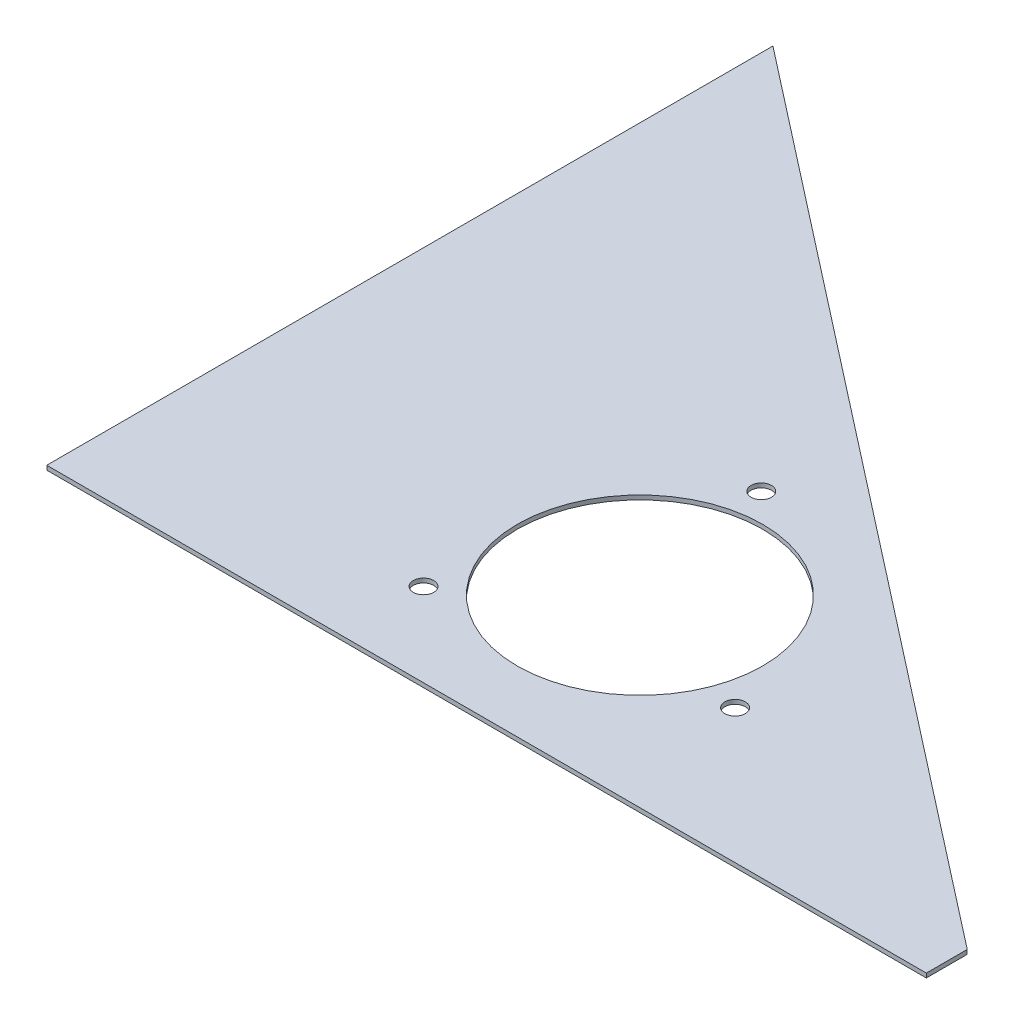
ISO-10303-21;
HEADER;
FILE_DESCRIPTION(('STEP AP214'),'2;1');
FILE_NAME('part.step','',(''),(''),'','','');
FILE_SCHEMA(('AUTOMOTIVE_DESIGN { 1 0 10303 214 1 1 1 1 }'));
ENDSEC;
DATA;
#1=APPLICATION_CONTEXT('core data for automotive mechanical design processes');
#2=APPLICATION_PROTOCOL_DEFINITION('international standard','automotive_design',2000,#1);
#3=PRODUCT_CONTEXT('',#1,'mechanical');
#4=PRODUCT('Part','Part','',(#3));
#5=PRODUCT_RELATED_PRODUCT_CATEGORY('part','',(#4));
#6=PRODUCT_DEFINITION_FORMATION('','',#4);
#7=PRODUCT_DEFINITION_CONTEXT('part definition',#1,'design');
#8=PRODUCT_DEFINITION('design','',#6,#7);
#9=PRODUCT_DEFINITION_SHAPE('','',#8);
#10=(LENGTH_UNIT() NAMED_UNIT(*) SI_UNIT(.MILLI.,.METRE.));
#11=(NAMED_UNIT(*) PLANE_ANGLE_UNIT() SI_UNIT($,.RADIAN.));
#12=(NAMED_UNIT(*) SI_UNIT($,.STERADIAN.) SOLID_ANGLE_UNIT());
#13=UNCERTAINTY_MEASURE_WITH_UNIT(LENGTH_MEASURE(1.E-05),#10,'distance_accuracy_value','');
#14=(GEOMETRIC_REPRESENTATION_CONTEXT(3) GLOBAL_UNCERTAINTY_ASSIGNED_CONTEXT((#13)) GLOBAL_UNIT_ASSIGNED_CONTEXT((#10,
#11,#12)) REPRESENTATION_CONTEXT('',''));
#15=CARTESIAN_POINT('',(0.,0.,0.));
#16=DIRECTION('',(0.,0.,1.));
#17=DIRECTION('',(1.,0.,0.));
#18=AXIS2_PLACEMENT_3D('',#15,#16,#17);
#19=CARTESIAN_POINT('',(546.1,2.65684,-25.4));
#20=DIRECTION('',(-0.614575452616154,0.,0.788858043656556));
#21=DIRECTION('',(0.788858043656556,0.,0.614575452616154));
#22=AXIS2_PLACEMENT_3D('',#19,#20,#21);
#23=PLANE('',#22);
#24=DIRECTION('',(-0.788858043656556,0.,-0.614575452616154));
#25=VECTOR('',#24,1.);
#26=CARTESIAN_POINT('',(546.1,0.,-25.4));
#27=LINE('',#26,#25);
#28=CARTESIAN_POINT('',(546.1,0.,-25.4));
#29=VERTEX_POINT('',#28);
#30=CARTESIAN_POINT('',(0.,0.,-450.85));
#31=VERTEX_POINT('',#30);
#32=EDGE_CURVE('E99',#29,#31,#27,.T.);
#33=ORIENTED_EDGE('',*,*,#32,.T.);
#34=DIRECTION('',(0.,-1.,0.));
#35=VECTOR('',#34,1.);
#36=CARTESIAN_POINT('',(0.,2.65684,-450.85));
#37=LINE('',#36,#35);
#38=CARTESIAN_POINT('',(0.,2.65684,-450.85));
#39=VERTEX_POINT('',#38);
#40=EDGE_CURVE('E11',#39,#31,#37,.T.);
#41=ORIENTED_EDGE('',*,*,#40,.F.);
#42=DIRECTION('',(-0.788858043656556,0.,-0.614575452616154));
#43=VECTOR('',#42,1.);
#44=CARTESIAN_POINT('',(546.1,2.65684,-25.4));
#45=LINE('',#44,#43);
#46=CARTESIAN_POINT('',(546.1,2.65684,-25.4));
#47=VERTEX_POINT('',#46);
#48=EDGE_CURVE('E87',#47,#39,#45,.T.);
#49=ORIENTED_EDGE('',*,*,#48,.F.);
#50=DIRECTION('',(0.,-1.,0.));
#51=VECTOR('',#50,1.);
#52=CARTESIAN_POINT('',(546.1,2.65684,-25.4));
#53=LINE('',#52,#51);
#54=EDGE_CURVE('E95',#47,#29,#53,.T.);
#55=ORIENTED_EDGE('',*,*,#54,.T.);
#56=EDGE_LOOP('',(#33,#41,#49,#55));
#57=FACE_BOUND('',#56,.T.);
#58=ADVANCED_FACE('F36',(#57),#23,.F.);
#59=CARTESIAN_POINT('',(0.,2.65684,-450.85));
#60=DIRECTION('',(1.,0.,0.));
#61=DIRECTION('',(0.,0.,-1.));
#62=AXIS2_PLACEMENT_3D('',#59,#60,#61);
#63=PLANE('',#62);
#64=DIRECTION('',(0.,0.,1.));
#65=VECTOR('',#64,1.);
#66=CARTESIAN_POINT('',(0.,0.,-450.85));
#67=LINE('',#66,#65);
#68=CARTESIAN_POINT('',(0.,0.,0.));
#69=VERTEX_POINT('',#68);
#70=EDGE_CURVE('E91',#31,#69,#67,.T.);
#71=ORIENTED_EDGE('',*,*,#70,.T.);
#72=DIRECTION('',(0.,-1.,0.));
#73=VECTOR('',#72,1.);
#74=CARTESIAN_POINT('',(0.,2.65684,0.));
#75=LINE('',#74,#73);
#76=CARTESIAN_POINT('',(0.,2.65684,0.));
#77=VERTEX_POINT('',#76);
#78=EDGE_CURVE('E44',#77,#69,#75,.T.);
#79=ORIENTED_EDGE('',*,*,#78,.F.);
#80=DIRECTION('',(0.,0.,1.));
#81=VECTOR('',#80,1.);
#82=CARTESIAN_POINT('',(0.,2.65684,-450.85));
#83=LINE('',#82,#81);
#84=EDGE_CURVE('E82',#39,#77,#83,.T.);
#85=ORIENTED_EDGE('',*,*,#84,.F.);
#86=ORIENTED_EDGE('',*,*,#40,.T.);
#87=EDGE_LOOP('',(#71,#79,#85,#86));
#88=FACE_BOUND('',#87,.T.);
#89=ADVANCED_FACE('F90',(#88),#63,.F.);
#90=CARTESIAN_POINT('',(0.,2.65684,0.));
#91=DIRECTION('',(0.,0.,-1.));
#92=DIRECTION('',(-1.,0.,0.));
#93=AXIS2_PLACEMENT_3D('',#90,#91,#92);
#94=PLANE('',#93);
#95=DIRECTION('',(1.,0.,0.));
#96=VECTOR('',#95,1.);
#97=CARTESIAN_POINT('',(0.,0.,0.));
#98=LINE('',#97,#96);
#99=CARTESIAN_POINT('',(546.1,0.,0.));
#100=VERTEX_POINT('',#99);
#101=EDGE_CURVE('E69',#69,#100,#98,.T.);
#102=ORIENTED_EDGE('',*,*,#101,.T.);
#103=DIRECTION('',(0.,-1.,0.));
#104=VECTOR('',#103,1.);
#105=CARTESIAN_POINT('',(546.1,2.65684,0.));
#106=LINE('',#105,#104);
#107=CARTESIAN_POINT('',(546.1,2.65684,0.));
#108=VERTEX_POINT('',#107);
#109=EDGE_CURVE('E92',#108,#100,#106,.T.);
#110=ORIENTED_EDGE('',*,*,#109,.F.);
#111=DIRECTION('',(1.,0.,0.));
#112=VECTOR('',#111,1.);
#113=CARTESIAN_POINT('',(0.,2.65684,0.));
#114=LINE('',#113,#112);
#115=EDGE_CURVE('E85',#77,#108,#114,.T.);
#116=ORIENTED_EDGE('',*,*,#115,.F.);
#117=ORIENTED_EDGE('',*,*,#78,.T.);
#118=EDGE_LOOP('',(#102,#110,#116,#117));
#119=FACE_BOUND('',#118,.T.);
#120=ADVANCED_FACE('F93',(#119),#94,.F.);
#121=CARTESIAN_POINT('',(546.1,2.65684,0.));
#122=DIRECTION('',(-1.,0.,0.));
#123=DIRECTION('',(0.,0.,1.));
#124=AXIS2_PLACEMENT_3D('',#121,#122,#123);
#125=PLANE('',#124);
#126=DIRECTION('',(0.,0.,-1.));
#127=VECTOR('',#126,1.);
#128=CARTESIAN_POINT('',(546.1,0.,0.));
#129=LINE('',#128,#127);
#130=EDGE_CURVE('E75',#100,#29,#129,.T.);
#131=ORIENTED_EDGE('',*,*,#130,.T.);
#132=ORIENTED_EDGE('',*,*,#54,.F.);
#133=DIRECTION('',(0.,0.,-1.));
#134=VECTOR('',#133,1.);
#135=CARTESIAN_POINT('',(546.1,2.65684,0.));
#136=LINE('',#135,#134);
#137=EDGE_CURVE('E52',#108,#47,#136,.T.);
#138=ORIENTED_EDGE('',*,*,#137,.F.);
#139=ORIENTED_EDGE('',*,*,#109,.T.);
#140=EDGE_LOOP('',(#131,#132,#138,#139));
#141=FACE_BOUND('',#140,.T.);
#142=ADVANCED_FACE('F107',(#141),#125,.F.);
#143=CARTESIAN_POINT('',(0.,2.65684,0.));
#144=DIRECTION('',(0.,1.,0.));
#145=DIRECTION('',(0.,0.,1.));
#146=AXIS2_PLACEMENT_3D('',#143,#144,#145);
#147=PLANE('',#146);
#148=CARTESIAN_POINT('',(182.113912483781,2.65684,-51.8103774886559));
#149=DIRECTION('',(0.,-1.,0.));
#150=DIRECTION('',(0.,0.,-1.));
#151=AXIS2_PLACEMENT_3D('',#148,#149,#150);
#152=CIRCLE('',#151,6.34999999999999);
#153=CARTESIAN_POINT('',(182.113912483781,2.65684,-58.1603774886558));
#154=VERTEX_POINT('',#153);
#155=EDGE_CURVE('E128',#154,#154,#152,.T.);
#156=ORIENTED_EDGE('',*,*,#155,.T.);
#157=EDGE_LOOP('',(#156));
#158=FACE_BOUND('',#157,.T.);
#159=CARTESIAN_POINT('',(235.825443190386,2.65684,-207.799989223392));
#160=DIRECTION('',(0.,-1.,0.));
#161=DIRECTION('',(0.,0.,-1.));
#162=AXIS2_PLACEMENT_3D('',#159,#160,#161);
#163=CIRCLE('',#162,6.34999999999996);
#164=CARTESIAN_POINT('',(235.825443190386,2.65684,-214.149989223392));
#165=VERTEX_POINT('',#164);
#166=EDGE_CURVE('E122',#165,#165,#163,.T.);
#167=ORIENTED_EDGE('',*,*,#166,.T.);
#168=EDGE_LOOP('',(#167));
#169=FACE_BOUND('',#168,.T.);
#170=CARTESIAN_POINT('',(344.060644325835,2.65684,-83.2896332879559));
#171=DIRECTION('',(0.,-1.,0.));
#172=DIRECTION('',(0.,0.,-1.));
#173=AXIS2_PLACEMENT_3D('',#170,#171,#172);
#174=CIRCLE('',#173,6.35);
#175=CARTESIAN_POINT('',(344.060644325835,2.65684,-89.6396332879559));
#176=VERTEX_POINT('',#175);
#177=EDGE_CURVE('E116',#176,#176,#174,.T.);
#178=ORIENTED_EDGE('',*,*,#177,.T.);
#179=EDGE_LOOP('',(#178));
#180=FACE_BOUND('',#179,.T.);
#181=CARTESIAN_POINT('',(254.,2.65684,-114.3));
#182=DIRECTION('',(0.,-1.,0.));
#183=DIRECTION('',(0.,0.,-1.));
#184=AXIS2_PLACEMENT_3D('',#181,#182,#183);
#185=CIRCLE('',#184,76.2);
#186=CARTESIAN_POINT('',(254.,2.65684,-190.5));
#187=VERTEX_POINT('',#186);
#188=EDGE_CURVE('E102',#187,#187,#185,.T.);
#189=ORIENTED_EDGE('',*,*,#188,.T.);
#190=EDGE_LOOP('',(#189));
#191=FACE_BOUND('',#190,.T.);
#192=ORIENTED_EDGE('',*,*,#48,.T.);
#193=ORIENTED_EDGE('',*,*,#84,.T.);
#194=ORIENTED_EDGE('',*,*,#115,.T.);
#195=ORIENTED_EDGE('',*,*,#137,.T.);
#196=EDGE_LOOP('',(#192,#193,#194,#195));
#197=FACE_BOUND('',#196,.T.);
#198=ADVANCED_FACE('F83',(#158,#169,#180,#191,#197),#147,.T.);
#199=CARTESIAN_POINT('',(0.,0.,0.));
#200=DIRECTION('',(0.,1.,0.));
#201=DIRECTION('',(0.,0.,1.));
#202=AXIS2_PLACEMENT_3D('',#199,#200,#201);
#203=PLANE('',#202);
#204=CARTESIAN_POINT('',(182.113912483781,0.,-51.8103774886559));
#205=DIRECTION('',(0.,-1.,0.));
#206=DIRECTION('',(0.,0.,-1.));
#207=AXIS2_PLACEMENT_3D('',#204,#205,#206);
#208=CIRCLE('',#207,6.34999999999999);
#209=CARTESIAN_POINT('',(182.113912483781,0.,-58.1603774886558));
#210=VERTEX_POINT('',#209);
#211=EDGE_CURVE('E131',#210,#210,#208,.T.);
#212=ORIENTED_EDGE('',*,*,#211,.F.);
#213=EDGE_LOOP('',(#212));
#214=FACE_BOUND('',#213,.T.);
#215=CARTESIAN_POINT('',(235.825443190386,0.,-207.799989223392));
#216=DIRECTION('',(0.,-1.,0.));
#217=DIRECTION('',(0.,0.,-1.));
#218=AXIS2_PLACEMENT_3D('',#215,#216,#217);
#219=CIRCLE('',#218,6.34999999999996);
#220=CARTESIAN_POINT('',(235.825443190386,0.,-214.149989223392));
#221=VERTEX_POINT('',#220);
#222=EDGE_CURVE('E125',#221,#221,#219,.T.);
#223=ORIENTED_EDGE('',*,*,#222,.F.);
#224=EDGE_LOOP('',(#223));
#225=FACE_BOUND('',#224,.T.);
#226=CARTESIAN_POINT('',(344.060644325835,0.,-83.2896332879559));
#227=DIRECTION('',(0.,-1.,0.));
#228=DIRECTION('',(0.,0.,-1.));
#229=AXIS2_PLACEMENT_3D('',#226,#227,#228);
#230=CIRCLE('',#229,6.35);
#231=CARTESIAN_POINT('',(344.060644325835,0.,-89.6396332879559));
#232=VERTEX_POINT('',#231);
#233=EDGE_CURVE('E119',#232,#232,#230,.T.);
#234=ORIENTED_EDGE('',*,*,#233,.F.);
#235=EDGE_LOOP('',(#234));
#236=FACE_BOUND('',#235,.T.);
#237=CARTESIAN_POINT('',(254.,0.,-114.3));
#238=DIRECTION('',(0.,-1.,0.));
#239=DIRECTION('',(0.,0.,-1.));
#240=AXIS2_PLACEMENT_3D('',#237,#238,#239);
#241=CIRCLE('',#240,76.2);
#242=CARTESIAN_POINT('',(254.,0.,-190.5));
#243=VERTEX_POINT('',#242);
#244=EDGE_CURVE('E113',#243,#243,#241,.T.);
#245=ORIENTED_EDGE('',*,*,#244,.F.);
#246=EDGE_LOOP('',(#245));
#247=FACE_BOUND('',#246,.T.);
#248=ORIENTED_EDGE('',*,*,#32,.F.);
#249=ORIENTED_EDGE('',*,*,#130,.F.);
#250=ORIENTED_EDGE('',*,*,#101,.F.);
#251=ORIENTED_EDGE('',*,*,#70,.F.);
#252=EDGE_LOOP('',(#248,#249,#250,#251));
#253=FACE_BOUND('',#252,.T.);
#254=ADVANCED_FACE('F110',(#214,#225,#236,#247,#253),#203,.F.);
#255=CARTESIAN_POINT('',(254.,2.65684,-114.3));
#256=DIRECTION('',(0.,-1.,0.));
#257=DIRECTION('',(0.,0.,-1.));
#258=AXIS2_PLACEMENT_3D('',#255,#256,#257);
#259=CYLINDRICAL_SURFACE('',#258,76.2);
#260=CARTESIAN_POINT('',(254.,2.65684,-190.5));
#261=CARTESIAN_POINT('',(254.,2.62916458333333,-190.5));
#262=CARTESIAN_POINT('',(254.,2.60148916666667,-190.5));
#263=CARTESIAN_POINT('',(254.,2.54613833333333,-190.5));
#264=CARTESIAN_POINT('',(254.,2.51846291666667,-190.5));
#265=CARTESIAN_POINT('',(254.,2.46311208333333,-190.5));
#266=CARTESIAN_POINT('',(254.,2.43543666666667,-190.5));
#267=CARTESIAN_POINT('',(254.,2.38008583333333,-190.5));
#268=CARTESIAN_POINT('',(254.,2.35241041666667,-190.5));
#269=CARTESIAN_POINT('',(254.,2.29705958333333,-190.5));
#270=CARTESIAN_POINT('',(254.,2.26938416666667,-190.5));
#271=CARTESIAN_POINT('',(254.,2.21403333333333,-190.5));
#272=CARTESIAN_POINT('',(254.,2.18635791666667,-190.5));
#273=CARTESIAN_POINT('',(254.,2.13100708333333,-190.5));
#274=CARTESIAN_POINT('',(254.,2.10333166666667,-190.5));
#275=CARTESIAN_POINT('',(254.,2.04798083333333,-190.5));
#276=CARTESIAN_POINT('',(254.,2.02030541666667,-190.5));
#277=CARTESIAN_POINT('',(254.,1.96495458333333,-190.5));
#278=CARTESIAN_POINT('',(254.,1.93727916666667,-190.5));
#279=CARTESIAN_POINT('',(254.,1.88192833333333,-190.5));
#280=CARTESIAN_POINT('',(254.,1.85425291666667,-190.5));
#281=CARTESIAN_POINT('',(254.,1.79890208333333,-190.5));
#282=CARTESIAN_POINT('',(254.,1.77122666666667,-190.5));
#283=CARTESIAN_POINT('',(254.,1.71587583333333,-190.5));
#284=CARTESIAN_POINT('',(254.,1.68820041666667,-190.5));
#285=CARTESIAN_POINT('',(254.,1.63284958333333,-190.5));
#286=CARTESIAN_POINT('',(254.,1.60517416666667,-190.5));
#287=CARTESIAN_POINT('',(254.,1.54982333333333,-190.5));
#288=CARTESIAN_POINT('',(254.,1.52214791666667,-190.5));
#289=CARTESIAN_POINT('',(254.,1.46679708333333,-190.5));
#290=CARTESIAN_POINT('',(254.,1.43912166666667,-190.5));
#291=CARTESIAN_POINT('',(254.,1.38377083333333,-190.5));
#292=CARTESIAN_POINT('',(254.,1.35609541666667,-190.5));
#293=CARTESIAN_POINT('',(254.,1.30074458333333,-190.5));
#294=CARTESIAN_POINT('',(254.,1.27306916666667,-190.5));
#295=CARTESIAN_POINT('',(254.,1.21771833333333,-190.5));
#296=CARTESIAN_POINT('',(254.,1.19004291666667,-190.5));
#297=CARTESIAN_POINT('',(254.,1.13469208333333,-190.5));
#298=CARTESIAN_POINT('',(254.,1.10701666666667,-190.5));
#299=CARTESIAN_POINT('',(254.,1.05166583333333,-190.5));
#300=CARTESIAN_POINT('',(254.,1.02399041666667,-190.5));
#301=CARTESIAN_POINT('',(254.,0.968639583333334,-190.5));
#302=CARTESIAN_POINT('',(254.,0.940964166666667,-190.5));
#303=CARTESIAN_POINT('',(254.,0.885613333333334,-190.5));
#304=CARTESIAN_POINT('',(254.,0.857937916666667,-190.5));
#305=CARTESIAN_POINT('',(254.,0.802587083333334,-190.5));
#306=CARTESIAN_POINT('',(254.,0.774911666666667,-190.5));
#307=CARTESIAN_POINT('',(254.,0.719560833333334,-190.5));
#308=CARTESIAN_POINT('',(254.,0.691885416666667,-190.5));
#309=CARTESIAN_POINT('',(254.,0.636534583333334,-190.5));
#310=CARTESIAN_POINT('',(254.,0.608859166666667,-190.5));
#311=CARTESIAN_POINT('',(254.,0.553508333333334,-190.5));
#312=CARTESIAN_POINT('',(254.,0.525832916666667,-190.5));
#313=CARTESIAN_POINT('',(254.,0.470482083333334,-190.5));
#314=CARTESIAN_POINT('',(254.,0.442806666666667,-190.5));
#315=CARTESIAN_POINT('',(254.,0.387455833333334,-190.5));
#316=CARTESIAN_POINT('',(254.,0.359780416666667,-190.5));
#317=CARTESIAN_POINT('',(254.,0.304429583333334,-190.5));
#318=CARTESIAN_POINT('',(254.,0.276754166666667,-190.5));
#319=CARTESIAN_POINT('',(254.,0.221403333333334,-190.5));
#320=CARTESIAN_POINT('',(254.,0.193727916666667,-190.5));
#321=CARTESIAN_POINT('',(254.,0.138377083333334,-190.5));
#322=CARTESIAN_POINT('',(254.,0.110701666666667,-190.5));
#323=CARTESIAN_POINT('',(254.,0.0553508333333336,-190.5));
#324=CARTESIAN_POINT('',(254.,0.027675416666667,-190.5));
#325=CARTESIAN_POINT('',(254.,0.,-190.5));
#326=B_SPLINE_CURVE_WITH_KNOTS('',3,(#260,#261,#262,#263,#264,#265,#266,#267,#268,#269,#270,
#271,#272,#273,#274,#275,#276,#277,#278,#279,#280,#281,#282,#283,#284,#285,#286,#287,#288,#289,
#290,#291,#292,#293,#294,#295,#296,#297,#298,#299,#300,#301,#302,#303,#304,#305,#306,#307,#308,
#309,#310,#311,#312,#313,#314,#315,#316,#317,#318,#319,#320,#321,#322,#323,#324,#325),
.UNSPECIFIED.,.F.,.F.,(4,2,2,2,2,2,2,2,2,2,2,2,2,2,2,2,2,2,2,2,2,2,2,2,2,2,2,2,2,2,2,2,4),(0.,
0.0830262499999998,0.1660525,0.24907875,0.332105,0.41513125,0.4981575,0.581183749999999,0.66421,
0.747236249999999,0.8302625,0.91328875,0.996314999999999,1.07934125,1.1623675,1.24539375,
1.32842,1.41144625,1.4944725,1.57749875,1.660525,1.74355125,1.8265775,1.90960375,1.99263,
2.07565625,2.1586825,2.24170875,2.324735,2.40776125,2.4907875,2.57381375,2.65684),.UNSPECIFIED.);
#327=EDGE_CURVE('BSEAM148',#187,#243,#326,.T.);
#328=ORIENTED_EDGE('',*,*,#188,.F.);
#329=ORIENTED_EDGE('',*,*,#244,.T.);
#330=ORIENTED_EDGE('',*,*,#327,.T.);
#331=ORIENTED_EDGE('',*,*,#327,.F.);
#332=EDGE_LOOP('',(#328,#330,#329,#331));
#333=FACE_BOUND('',#332,.T.);
#334=ADVANCED_FACE('F148',(#333),#259,.F.);
#335=CARTESIAN_POINT('',(344.060644325835,2.65684,-83.2896332879559));
#336=DIRECTION('',(0.,-1.,0.));
#337=DIRECTION('',(0.,0.,-1.));
#338=AXIS2_PLACEMENT_3D('',#335,#336,#337);
#339=CYLINDRICAL_SURFACE('',#338,6.35);
#340=CARTESIAN_POINT('',(344.060644325835,2.65684,-89.6396332879559));
#341=CARTESIAN_POINT('',(344.060644325835,2.62916458333333,-89.6396332879559));
#342=CARTESIAN_POINT('',(344.060644325835,2.60148916666667,-89.6396332879559));
#343=CARTESIAN_POINT('',(344.060644325835,2.54613833333333,-89.6396332879559));
#344=CARTESIAN_POINT('',(344.060644325835,2.51846291666667,-89.6396332879559));
#345=CARTESIAN_POINT('',(344.060644325835,2.46311208333333,-89.6396332879559));
#346=CARTESIAN_POINT('',(344.060644325835,2.43543666666667,-89.6396332879559));
#347=CARTESIAN_POINT('',(344.060644325835,2.38008583333333,-89.6396332879559));
#348=CARTESIAN_POINT('',(344.060644325835,2.35241041666667,-89.6396332879559));
#349=CARTESIAN_POINT('',(344.060644325835,2.29705958333333,-89.6396332879559));
#350=CARTESIAN_POINT('',(344.060644325835,2.26938416666667,-89.6396332879559));
#351=CARTESIAN_POINT('',(344.060644325835,2.21403333333333,-89.6396332879559));
#352=CARTESIAN_POINT('',(344.060644325835,2.18635791666667,-89.6396332879559));
#353=CARTESIAN_POINT('',(344.060644325835,2.13100708333333,-89.6396332879559));
#354=CARTESIAN_POINT('',(344.060644325835,2.10333166666667,-89.6396332879559));
#355=CARTESIAN_POINT('',(344.060644325835,2.04798083333333,-89.6396332879559));
#356=CARTESIAN_POINT('',(344.060644325835,2.02030541666667,-89.6396332879559));
#357=CARTESIAN_POINT('',(344.060644325835,1.96495458333333,-89.6396332879559));
#358=CARTESIAN_POINT('',(344.060644325835,1.93727916666667,-89.6396332879559));
#359=CARTESIAN_POINT('',(344.060644325835,1.88192833333333,-89.6396332879559));
#360=CARTESIAN_POINT('',(344.060644325835,1.85425291666667,-89.6396332879559));
#361=CARTESIAN_POINT('',(344.060644325835,1.79890208333333,-89.6396332879559));
#362=CARTESIAN_POINT('',(344.060644325835,1.77122666666667,-89.6396332879559));
#363=CARTESIAN_POINT('',(344.060644325835,1.71587583333333,-89.6396332879559));
#364=CARTESIAN_POINT('',(344.060644325835,1.68820041666667,-89.6396332879559));
#365=CARTESIAN_POINT('',(344.060644325835,1.63284958333333,-89.6396332879559));
#366=CARTESIAN_POINT('',(344.060644325835,1.60517416666667,-89.6396332879559));
#367=CARTESIAN_POINT('',(344.060644325835,1.54982333333333,-89.6396332879559));
#368=CARTESIAN_POINT('',(344.060644325835,1.52214791666667,-89.6396332879559));
#369=CARTESIAN_POINT('',(344.060644325835,1.46679708333333,-89.6396332879559));
#370=CARTESIAN_POINT('',(344.060644325835,1.43912166666667,-89.6396332879559));
#371=CARTESIAN_POINT('',(344.060644325835,1.38377083333333,-89.6396332879559));
#372=CARTESIAN_POINT('',(344.060644325835,1.35609541666667,-89.6396332879559));
#373=CARTESIAN_POINT('',(344.060644325835,1.30074458333333,-89.6396332879559));
#374=CARTESIAN_POINT('',(344.060644325835,1.27306916666667,-89.6396332879559));
#375=CARTESIAN_POINT('',(344.060644325835,1.21771833333333,-89.6396332879559));
#376=CARTESIAN_POINT('',(344.060644325835,1.19004291666667,-89.6396332879559));
#377=CARTESIAN_POINT('',(344.060644325835,1.13469208333333,-89.6396332879559));
#378=CARTESIAN_POINT('',(344.060644325835,1.10701666666667,-89.6396332879559));
#379=CARTESIAN_POINT('',(344.060644325835,1.05166583333333,-89.6396332879559));
#380=CARTESIAN_POINT('',(344.060644325835,1.02399041666667,-89.6396332879559));
#381=CARTESIAN_POINT('',(344.060644325835,0.968639583333333,-89.6396332879559));
#382=CARTESIAN_POINT('',(344.060644325835,0.940964166666667,-89.6396332879559));
#383=CARTESIAN_POINT('',(344.060644325835,0.885613333333333,-89.6396332879559));
#384=CARTESIAN_POINT('',(344.060644325835,0.857937916666667,-89.6396332879559));
#385=CARTESIAN_POINT('',(344.060644325835,0.802587083333333,-89.6396332879559));
#386=CARTESIAN_POINT('',(344.060644325835,0.774911666666667,-89.6396332879559));
#387=CARTESIAN_POINT('',(344.060644325835,0.719560833333334,-89.6396332879559));
#388=CARTESIAN_POINT('',(344.060644325835,0.691885416666667,-89.6396332879559));
#389=CARTESIAN_POINT('',(344.060644325835,0.636534583333334,-89.6396332879559));
#390=CARTESIAN_POINT('',(344.060644325835,0.608859166666667,-89.6396332879559));
#391=CARTESIAN_POINT('',(344.060644325835,0.553508333333334,-89.6396332879559));
#392=CARTESIAN_POINT('',(344.060644325835,0.525832916666667,-89.6396332879559));
#393=CARTESIAN_POINT('',(344.060644325835,0.470482083333334,-89.6396332879559));
#394=CARTESIAN_POINT('',(344.060644325835,0.442806666666667,-89.6396332879559));
#395=CARTESIAN_POINT('',(344.060644325835,0.387455833333334,-89.6396332879559));
#396=CARTESIAN_POINT('',(344.060644325835,0.359780416666667,-89.6396332879559));
#397=CARTESIAN_POINT('',(344.060644325835,0.304429583333334,-89.6396332879559));
#398=CARTESIAN_POINT('',(344.060644325835,0.276754166666667,-89.6396332879559));
#399=CARTESIAN_POINT('',(344.060644325835,0.221403333333334,-89.6396332879559));
#400=CARTESIAN_POINT('',(344.060644325835,0.193727916666667,-89.6396332879559));
#401=CARTESIAN_POINT('',(344.060644325835,0.138377083333334,-89.6396332879559));
#402=CARTESIAN_POINT('',(344.060644325835,0.110701666666667,-89.6396332879559));
#403=CARTESIAN_POINT('',(344.060644325835,0.0553508333333336,-89.6396332879559));
#404=CARTESIAN_POINT('',(344.060644325835,0.027675416666667,-89.6396332879559));
#405=CARTESIAN_POINT('',(344.060644325835,0.,-89.6396332879559));
#406=B_SPLINE_CURVE_WITH_KNOTS('',3,(#340,#341,#342,#343,#344,#345,#346,#347,#348,#349,#350,
#351,#352,#353,#354,#355,#356,#357,#358,#359,#360,#361,#362,#363,#364,#365,#366,#367,#368,#369,
#370,#371,#372,#373,#374,#375,#376,#377,#378,#379,#380,#381,#382,#383,#384,#385,#386,#387,#388,
#389,#390,#391,#392,#393,#394,#395,#396,#397,#398,#399,#400,#401,#402,#403,#404,#405),
.UNSPECIFIED.,.F.,.F.,(4,2,2,2,2,2,2,2,2,2,2,2,2,2,2,2,2,2,2,2,2,2,2,2,2,2,2,2,2,2,2,2,4),(0.,
0.0830262500000002,0.1660525,0.24907875,0.332105,0.41513125,0.4981575,0.58118375,0.66421,
0.74723625,0.8302625,0.91328875,0.996315,1.07934125,1.1623675,1.24539375,1.32842,1.41144625,
1.4944725,1.57749875,1.660525,1.74355125,1.8265775,1.90960375,1.99263,2.07565625,2.1586825,
2.24170875,2.324735,2.40776125,2.4907875,2.57381375,2.65684),.UNSPECIFIED.);
#407=EDGE_CURVE('BSEAM157',#176,#232,#406,.T.);
#408=ORIENTED_EDGE('',*,*,#177,.F.);
#409=ORIENTED_EDGE('',*,*,#233,.T.);
#410=ORIENTED_EDGE('',*,*,#407,.T.);
#411=ORIENTED_EDGE('',*,*,#407,.F.);
#412=EDGE_LOOP('',(#408,#410,#409,#411));
#413=FACE_BOUND('',#412,.T.);
#414=ADVANCED_FACE('F157',(#413),#339,.F.);
#415=CARTESIAN_POINT('',(235.825443190386,2.65684,-207.799989223392));
#416=DIRECTION('',(0.,-1.,0.));
#417=DIRECTION('',(0.,0.,-1.));
#418=AXIS2_PLACEMENT_3D('',#415,#416,#417);
#419=CYLINDRICAL_SURFACE('',#418,6.34999999999996);
#420=CARTESIAN_POINT('',(235.825443190386,2.65684,-214.149989223392));
#421=CARTESIAN_POINT('',(235.825443190386,2.62916458333333,-214.149989223392));
#422=CARTESIAN_POINT('',(235.825443190386,2.60148916666667,-214.149989223392));
#423=CARTESIAN_POINT('',(235.825443190386,2.54613833333333,-214.149989223392));
#424=CARTESIAN_POINT('',(235.825443190386,2.51846291666667,-214.149989223392));
#425=CARTESIAN_POINT('',(235.825443190386,2.46311208333333,-214.149989223392));
#426=CARTESIAN_POINT('',(235.825443190386,2.43543666666667,-214.149989223392));
#427=CARTESIAN_POINT('',(235.825443190386,2.38008583333333,-214.149989223392));
#428=CARTESIAN_POINT('',(235.825443190386,2.35241041666667,-214.149989223392));
#429=CARTESIAN_POINT('',(235.825443190386,2.29705958333333,-214.149989223392));
#430=CARTESIAN_POINT('',(235.825443190386,2.26938416666667,-214.149989223392));
#431=CARTESIAN_POINT('',(235.825443190386,2.21403333333333,-214.149989223392));
#432=CARTESIAN_POINT('',(235.825443190386,2.18635791666667,-214.149989223392));
#433=CARTESIAN_POINT('',(235.825443190386,2.13100708333333,-214.149989223392));
#434=CARTESIAN_POINT('',(235.825443190386,2.10333166666667,-214.149989223392));
#435=CARTESIAN_POINT('',(235.825443190386,2.04798083333333,-214.149989223392));
#436=CARTESIAN_POINT('',(235.825443190386,2.02030541666667,-214.149989223392));
#437=CARTESIAN_POINT('',(235.825443190386,1.96495458333333,-214.149989223392));
#438=CARTESIAN_POINT('',(235.825443190386,1.93727916666667,-214.149989223392));
#439=CARTESIAN_POINT('',(235.825443190386,1.88192833333333,-214.149989223392));
#440=CARTESIAN_POINT('',(235.825443190386,1.85425291666667,-214.149989223392));
#441=CARTESIAN_POINT('',(235.825443190386,1.79890208333333,-214.149989223392));
#442=CARTESIAN_POINT('',(235.825443190386,1.77122666666667,-214.149989223392));
#443=CARTESIAN_POINT('',(235.825443190386,1.71587583333333,-214.149989223392));
#444=CARTESIAN_POINT('',(235.825443190386,1.68820041666667,-214.149989223392));
#445=CARTESIAN_POINT('',(235.825443190386,1.63284958333333,-214.149989223392));
#446=CARTESIAN_POINT('',(235.825443190386,1.60517416666667,-214.149989223392));
#447=CARTESIAN_POINT('',(235.825443190386,1.54982333333333,-214.149989223392));
#448=CARTESIAN_POINT('',(235.825443190386,1.52214791666667,-214.149989223392));
#449=CARTESIAN_POINT('',(235.825443190386,1.46679708333333,-214.149989223392));
#450=CARTESIAN_POINT('',(235.825443190386,1.43912166666667,-214.149989223392));
#451=CARTESIAN_POINT('',(235.825443190386,1.38377083333333,-214.149989223392));
#452=CARTESIAN_POINT('',(235.825443190386,1.35609541666667,-214.149989223392));
#453=CARTESIAN_POINT('',(235.825443190386,1.30074458333333,-214.149989223392));
#454=CARTESIAN_POINT('',(235.825443190386,1.27306916666667,-214.149989223392));
#455=CARTESIAN_POINT('',(235.825443190386,1.21771833333333,-214.149989223392));
#456=CARTESIAN_POINT('',(235.825443190386,1.19004291666667,-214.149989223392));
#457=CARTESIAN_POINT('',(235.825443190386,1.13469208333333,-214.149989223392));
#458=CARTESIAN_POINT('',(235.825443190386,1.10701666666667,-214.149989223392));
#459=CARTESIAN_POINT('',(235.825443190386,1.05166583333333,-214.149989223392));
#460=CARTESIAN_POINT('',(235.825443190386,1.02399041666667,-214.149989223392));
#461=CARTESIAN_POINT('',(235.825443190386,0.968639583333333,-214.149989223392));
#462=CARTESIAN_POINT('',(235.825443190386,0.940964166666667,-214.149989223392));
#463=CARTESIAN_POINT('',(235.825443190386,0.885613333333333,-214.149989223392));
#464=CARTESIAN_POINT('',(235.825443190386,0.857937916666667,-214.149989223392));
#465=CARTESIAN_POINT('',(235.825443190386,0.802587083333333,-214.149989223392));
#466=CARTESIAN_POINT('',(235.825443190386,0.774911666666667,-214.149989223392));
#467=CARTESIAN_POINT('',(235.825443190386,0.719560833333334,-214.149989223392));
#468=CARTESIAN_POINT('',(235.825443190386,0.691885416666667,-214.149989223392));
#469=CARTESIAN_POINT('',(235.825443190386,0.636534583333334,-214.149989223392));
#470=CARTESIAN_POINT('',(235.825443190386,0.608859166666667,-214.149989223392));
#471=CARTESIAN_POINT('',(235.825443190386,0.553508333333334,-214.149989223392));
#472=CARTESIAN_POINT('',(235.825443190386,0.525832916666667,-214.149989223392));
#473=CARTESIAN_POINT('',(235.825443190386,0.470482083333334,-214.149989223392));
#474=CARTESIAN_POINT('',(235.825443190386,0.442806666666667,-214.149989223392));
#475=CARTESIAN_POINT('',(235.825443190386,0.387455833333334,-214.149989223392));
#476=CARTESIAN_POINT('',(235.825443190386,0.359780416666667,-214.149989223392));
#477=CARTESIAN_POINT('',(235.825443190386,0.304429583333334,-214.149989223392));
#478=CARTESIAN_POINT('',(235.825443190386,0.276754166666667,-214.149989223392));
#479=CARTESIAN_POINT('',(235.825443190386,0.221403333333334,-214.149989223392));
#480=CARTESIAN_POINT('',(235.825443190386,0.193727916666667,-214.149989223392));
#481=CARTESIAN_POINT('',(235.825443190386,0.138377083333334,-214.149989223392));
#482=CARTESIAN_POINT('',(235.825443190386,0.110701666666667,-214.149989223392));
#483=CARTESIAN_POINT('',(235.825443190386,0.0553508333333336,-214.149989223392));
#484=CARTESIAN_POINT('',(235.825443190386,0.027675416666667,-214.149989223392));
#485=CARTESIAN_POINT('',(235.825443190386,0.,-214.149989223392));
#486=B_SPLINE_CURVE_WITH_KNOTS('',3,(#420,#421,#422,#423,#424,#425,#426,#427,#428,#429,#430,
#431,#432,#433,#434,#435,#436,#437,#438,#439,#440,#441,#442,#443,#444,#445,#446,#447,#448,#449,
#450,#451,#452,#453,#454,#455,#456,#457,#458,#459,#460,#461,#462,#463,#464,#465,#466,#467,#468,
#469,#470,#471,#472,#473,#474,#475,#476,#477,#478,#479,#480,#481,#482,#483,#484,#485),
.UNSPECIFIED.,.F.,.F.,(4,2,2,2,2,2,2,2,2,2,2,2,2,2,2,2,2,2,2,2,2,2,2,2,2,2,2,2,2,2,2,2,4),(0.,
0.0830262500000002,0.1660525,0.24907875,0.332105,0.41513125,0.4981575,0.58118375,0.66421,
0.74723625,0.8302625,0.91328875,0.996315,1.07934125,1.1623675,1.24539375,1.32842,1.41144625,
1.4944725,1.57749875,1.660525,1.74355125,1.8265775,1.90960375,1.99263,2.07565625,2.1586825,
2.24170875,2.324735,2.40776125,2.4907875,2.57381375,2.65684),.UNSPECIFIED.);
#487=EDGE_CURVE('BSEAM142',#165,#221,#486,.T.);
#488=ORIENTED_EDGE('',*,*,#166,.F.);
#489=ORIENTED_EDGE('',*,*,#222,.T.);
#490=ORIENTED_EDGE('',*,*,#487,.T.);
#491=ORIENTED_EDGE('',*,*,#487,.F.);
#492=EDGE_LOOP('',(#488,#490,#489,#491));
#493=FACE_BOUND('',#492,.T.);
#494=ADVANCED_FACE('F142',(#493),#419,.F.);
#495=CARTESIAN_POINT('',(182.113912483781,2.65684,-51.8103774886559));
#496=DIRECTION('',(0.,-1.,0.));
#497=DIRECTION('',(0.,0.,-1.));
#498=AXIS2_PLACEMENT_3D('',#495,#496,#497);
#499=CYLINDRICAL_SURFACE('',#498,6.34999999999999);
#500=CARTESIAN_POINT('',(182.113912483781,2.65684,-58.1603774886558));
#501=CARTESIAN_POINT('',(182.113912483781,2.62916458333333,-58.1603774886558));
#502=CARTESIAN_POINT('',(182.113912483781,2.60148916666667,-58.1603774886558));
#503=CARTESIAN_POINT('',(182.113912483781,2.54613833333333,-58.1603774886558));
#504=CARTESIAN_POINT('',(182.113912483781,2.51846291666667,-58.1603774886558));
#505=CARTESIAN_POINT('',(182.113912483781,2.46311208333333,-58.1603774886558));
#506=CARTESIAN_POINT('',(182.113912483781,2.43543666666667,-58.1603774886558));
#507=CARTESIAN_POINT('',(182.113912483781,2.38008583333333,-58.1603774886558));
#508=CARTESIAN_POINT('',(182.113912483781,2.35241041666667,-58.1603774886558));
#509=CARTESIAN_POINT('',(182.113912483781,2.29705958333333,-58.1603774886558));
#510=CARTESIAN_POINT('',(182.113912483781,2.26938416666667,-58.1603774886558));
#511=CARTESIAN_POINT('',(182.113912483781,2.21403333333333,-58.1603774886558));
#512=CARTESIAN_POINT('',(182.113912483781,2.18635791666667,-58.1603774886558));
#513=CARTESIAN_POINT('',(182.113912483781,2.13100708333333,-58.1603774886558));
#514=CARTESIAN_POINT('',(182.113912483781,2.10333166666667,-58.1603774886558));
#515=CARTESIAN_POINT('',(182.113912483781,2.04798083333333,-58.1603774886558));
#516=CARTESIAN_POINT('',(182.113912483781,2.02030541666667,-58.1603774886558));
#517=CARTESIAN_POINT('',(182.113912483781,1.96495458333333,-58.1603774886558));
#518=CARTESIAN_POINT('',(182.113912483781,1.93727916666667,-58.1603774886558));
#519=CARTESIAN_POINT('',(182.113912483781,1.88192833333333,-58.1603774886558));
#520=CARTESIAN_POINT('',(182.113912483781,1.85425291666667,-58.1603774886558));
#521=CARTESIAN_POINT('',(182.113912483781,1.79890208333333,-58.1603774886558));
#522=CARTESIAN_POINT('',(182.113912483781,1.77122666666667,-58.1603774886558));
#523=CARTESIAN_POINT('',(182.113912483781,1.71587583333333,-58.1603774886558));
#524=CARTESIAN_POINT('',(182.113912483781,1.68820041666667,-58.1603774886558));
#525=CARTESIAN_POINT('',(182.113912483781,1.63284958333333,-58.1603774886558));
#526=CARTESIAN_POINT('',(182.113912483781,1.60517416666667,-58.1603774886558));
#527=CARTESIAN_POINT('',(182.113912483781,1.54982333333333,-58.1603774886558));
#528=CARTESIAN_POINT('',(182.113912483781,1.52214791666667,-58.1603774886558));
#529=CARTESIAN_POINT('',(182.113912483781,1.46679708333333,-58.1603774886558));
#530=CARTESIAN_POINT('',(182.113912483781,1.43912166666667,-58.1603774886558));
#531=CARTESIAN_POINT('',(182.113912483781,1.38377083333333,-58.1603774886558));
#532=CARTESIAN_POINT('',(182.113912483781,1.35609541666667,-58.1603774886558));
#533=CARTESIAN_POINT('',(182.113912483781,1.30074458333333,-58.1603774886558));
#534=CARTESIAN_POINT('',(182.113912483781,1.27306916666667,-58.1603774886558));
#535=CARTESIAN_POINT('',(182.113912483781,1.21771833333333,-58.1603774886558));
#536=CARTESIAN_POINT('',(182.113912483781,1.19004291666667,-58.1603774886558));
#537=CARTESIAN_POINT('',(182.113912483781,1.13469208333333,-58.1603774886558));
#538=CARTESIAN_POINT('',(182.113912483781,1.10701666666667,-58.1603774886558));
#539=CARTESIAN_POINT('',(182.113912483781,1.05166583333333,-58.1603774886558));
#540=CARTESIAN_POINT('',(182.113912483781,1.02399041666667,-58.1603774886558));
#541=CARTESIAN_POINT('',(182.113912483781,0.968639583333333,-58.1603774886558));
#542=CARTESIAN_POINT('',(182.113912483781,0.940964166666667,-58.1603774886558));
#543=CARTESIAN_POINT('',(182.113912483781,0.885613333333333,-58.1603774886558));
#544=CARTESIAN_POINT('',(182.113912483781,0.857937916666667,-58.1603774886558));
#545=CARTESIAN_POINT('',(182.113912483781,0.802587083333333,-58.1603774886558));
#546=CARTESIAN_POINT('',(182.113912483781,0.774911666666667,-58.1603774886558));
#547=CARTESIAN_POINT('',(182.113912483781,0.719560833333334,-58.1603774886558));
#548=CARTESIAN_POINT('',(182.113912483781,0.691885416666667,-58.1603774886558));
#549=CARTESIAN_POINT('',(182.113912483781,0.636534583333334,-58.1603774886558));
#550=CARTESIAN_POINT('',(182.113912483781,0.608859166666667,-58.1603774886558));
#551=CARTESIAN_POINT('',(182.113912483781,0.553508333333334,-58.1603774886558));
#552=CARTESIAN_POINT('',(182.113912483781,0.525832916666667,-58.1603774886558));
#553=CARTESIAN_POINT('',(182.113912483781,0.470482083333334,-58.1603774886558));
#554=CARTESIAN_POINT('',(182.113912483781,0.442806666666667,-58.1603774886558));
#555=CARTESIAN_POINT('',(182.113912483781,0.387455833333334,-58.1603774886558));
#556=CARTESIAN_POINT('',(182.113912483781,0.359780416666667,-58.1603774886558));
#557=CARTESIAN_POINT('',(182.113912483781,0.304429583333334,-58.1603774886558));
#558=CARTESIAN_POINT('',(182.113912483781,0.276754166666667,-58.1603774886558));
#559=CARTESIAN_POINT('',(182.113912483781,0.221403333333334,-58.1603774886558));
#560=CARTESIAN_POINT('',(182.113912483781,0.193727916666667,-58.1603774886558));
#561=CARTESIAN_POINT('',(182.113912483781,0.138377083333334,-58.1603774886558));
#562=CARTESIAN_POINT('',(182.113912483781,0.110701666666667,-58.1603774886558));
#563=CARTESIAN_POINT('',(182.113912483781,0.0553508333333336,-58.1603774886558));
#564=CARTESIAN_POINT('',(182.113912483781,0.027675416666667,-58.1603774886558));
#565=CARTESIAN_POINT('',(182.113912483781,0.,-58.1603774886558));
#566=B_SPLINE_CURVE_WITH_KNOTS('',3,(#500,#501,#502,#503,#504,#505,#506,#507,#508,#509,#510,
#511,#512,#513,#514,#515,#516,#517,#518,#519,#520,#521,#522,#523,#524,#525,#526,#527,#528,#529,
#530,#531,#532,#533,#534,#535,#536,#537,#538,#539,#540,#541,#542,#543,#544,#545,#546,#547,#548,
#549,#550,#551,#552,#553,#554,#555,#556,#557,#558,#559,#560,#561,#562,#563,#564,#565),
.UNSPECIFIED.,.F.,.F.,(4,2,2,2,2,2,2,2,2,2,2,2,2,2,2,2,2,2,2,2,2,2,2,2,2,2,2,2,2,2,2,2,4),(0.,
0.0830262500000002,0.1660525,0.24907875,0.332105,0.41513125,0.4981575,0.58118375,0.66421,
0.74723625,0.8302625,0.91328875,0.996315,1.07934125,1.1623675,1.24539375,1.32842,1.41144625,
1.4944725,1.57749875,1.660525,1.74355125,1.8265775,1.90960375,1.99263,2.07565625,2.1586825,
2.24170875,2.324735,2.40776125,2.4907875,2.57381375,2.65684),.UNSPECIFIED.);
#567=EDGE_CURVE('BSEAM139',#154,#210,#566,.T.);
#568=ORIENTED_EDGE('',*,*,#155,.F.);
#569=ORIENTED_EDGE('',*,*,#211,.T.);
#570=ORIENTED_EDGE('',*,*,#567,.T.);
#571=ORIENTED_EDGE('',*,*,#567,.F.);
#572=EDGE_LOOP('',(#568,#570,#569,#571));
#573=FACE_BOUND('',#572,.T.);
#574=ADVANCED_FACE('F139',(#573),#499,.F.);
#575=CLOSED_SHELL('',(#58,#89,#120,#142,#198,#254,#334,#414,#494,#574));
#576=MANIFOLD_SOLID_BREP('B2',#575);
#577=ADVANCED_BREP_SHAPE_REPRESENTATION('',(#18,#576),#14);
#578=SHAPE_DEFINITION_REPRESENTATION(#9,#577);
ENDSEC;
END-ISO-10303-21;
